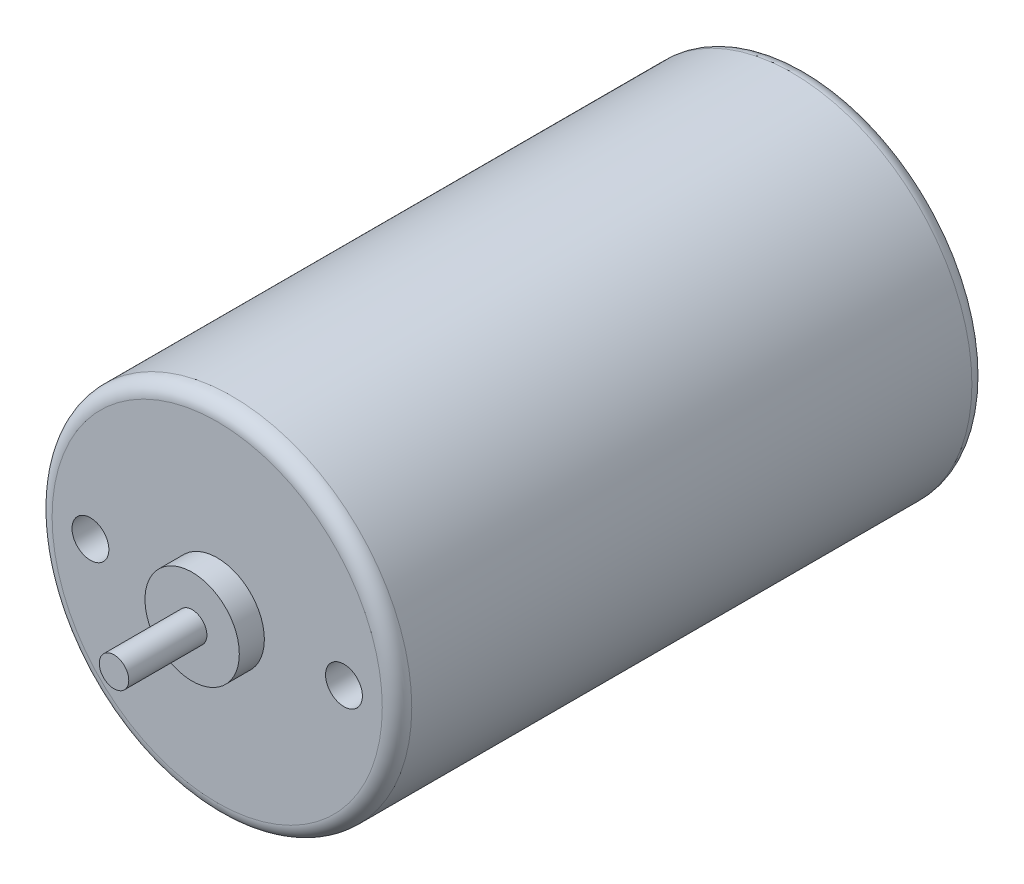
ISO-10303-21;
HEADER;
FILE_DESCRIPTION(('STEP AP214'),'2;1');
FILE_NAME('part.step','',(''),(''),'','','');
FILE_SCHEMA(('AUTOMOTIVE_DESIGN { 1 0 10303 214 1 1 1 1 }'));
ENDSEC;
DATA;
#1=APPLICATION_CONTEXT('core data for automotive mechanical design processes');
#2=APPLICATION_PROTOCOL_DEFINITION('international standard','automotive_design',2000,#1);
#3=PRODUCT_CONTEXT('',#1,'mechanical');
#4=PRODUCT('Part','Part','',(#3));
#5=PRODUCT_RELATED_PRODUCT_CATEGORY('part','',(#4));
#6=PRODUCT_DEFINITION_FORMATION('','',#4);
#7=PRODUCT_DEFINITION_CONTEXT('part definition',#1,'design');
#8=PRODUCT_DEFINITION('design','',#6,#7);
#9=PRODUCT_DEFINITION_SHAPE('','',#8);
#10=(LENGTH_UNIT() NAMED_UNIT(*) SI_UNIT(.MILLI.,.METRE.));
#11=(NAMED_UNIT(*) PLANE_ANGLE_UNIT() SI_UNIT($,.RADIAN.));
#12=(NAMED_UNIT(*) SI_UNIT($,.STERADIAN.) SOLID_ANGLE_UNIT());
#13=UNCERTAINTY_MEASURE_WITH_UNIT(LENGTH_MEASURE(1.E-05),#10,'distance_accuracy_value','');
#14=(GEOMETRIC_REPRESENTATION_CONTEXT(3) GLOBAL_UNCERTAINTY_ASSIGNED_CONTEXT((#13)) GLOBAL_UNIT_ASSIGNED_CONTEXT((#10,
#11,#12)) REPRESENTATION_CONTEXT('',''));
#15=CARTESIAN_POINT('',(0.,0.,0.));
#16=DIRECTION('',(0.,0.,1.));
#17=DIRECTION('',(1.,0.,0.));
#18=AXIS2_PLACEMENT_3D('',#15,#16,#17);
#19=CARTESIAN_POINT('',(0.,0.,40.));
#20=DIRECTION('',(0.,0.,-1.));
#21=DIRECTION('',(-1.,0.,0.));
#22=AXIS2_PLACEMENT_3D('',#19,#20,#21);
#23=CYLINDRICAL_SURFACE('',#22,12.2);
#24=CARTESIAN_POINT('',(0.,0.,1.));
#25=DIRECTION('',(0.,0.,1.));
#26=DIRECTION('',(1.,0.,0.));
#27=AXIS2_PLACEMENT_3D('',#24,#25,#26);
#28=CIRCLE('',#27,12.2);
#29=CARTESIAN_POINT('',(12.2,0.,1.));
#30=VERTEX_POINT('',#29);
#31=EDGE_CURVE('E50',#30,#30,#28,.T.);
#32=ORIENTED_EDGE('',*,*,#31,.T.);
#33=EDGE_LOOP('',(#32));
#34=FACE_BOUND('',#33,.T.);
#35=CARTESIAN_POINT('',(0.,0.,39.));
#36=DIRECTION('',(0.,0.,1.));
#37=DIRECTION('',(1.,0.,0.));
#38=AXIS2_PLACEMENT_3D('',#35,#36,#37);
#39=CIRCLE('',#38,12.2);
#40=CARTESIAN_POINT('',(12.2,0.,39.));
#41=VERTEX_POINT('',#40);
#42=EDGE_CURVE('E101',#41,#41,#39,.F.);
#43=ORIENTED_EDGE('',*,*,#42,.T.);
#44=EDGE_LOOP('',(#43));
#45=FACE_BOUND('',#44,.T.);
#46=ADVANCED_FACE('F41',(#34,#45),#23,.T.);
#47=CARTESIAN_POINT('',(0.,0.,40.));
#48=DIRECTION('',(0.,0.,1.));
#49=DIRECTION('',(1.,0.,0.));
#50=AXIS2_PLACEMENT_3D('',#47,#48,#49);
#51=PLANE('',#50);
#52=CARTESIAN_POINT('',(0.,0.,40.));
#53=DIRECTION('',(0.,0.,1.));
#54=DIRECTION('',(1.,0.,0.));
#55=AXIS2_PLACEMENT_3D('',#52,#53,#54);
#56=CIRCLE('',#55,11.2);
#57=CARTESIAN_POINT('',(11.2,0.,40.));
#58=VERTEX_POINT('',#57);
#59=EDGE_CURVE('E90',#58,#58,#56,.T.);
#60=ORIENTED_EDGE('',*,*,#59,.T.);
#61=EDGE_LOOP('',(#60));
#62=FACE_BOUND('',#61,.T.);
#63=CARTESIAN_POINT('',(-8.6,0.,40.));
#64=DIRECTION('',(0.,0.,1.));
#65=DIRECTION('',(1.,0.,0.));
#66=AXIS2_PLACEMENT_3D('',#63,#64,#65);
#67=CIRCLE('',#66,1.24999999999999);
#68=CARTESIAN_POINT('',(-7.35000000000001,0.,40.));
#69=VERTEX_POINT('',#68);
#70=EDGE_CURVE('E68',#69,#69,#67,.T.);
#71=ORIENTED_EDGE('',*,*,#70,.F.);
#72=EDGE_LOOP('',(#71));
#73=FACE_BOUND('',#72,.T.);
#74=CARTESIAN_POINT('',(8.6,0.,40.));
#75=DIRECTION('',(0.,0.,1.));
#76=DIRECTION('',(1.,0.,0.));
#77=AXIS2_PLACEMENT_3D('',#74,#75,#76);
#78=CIRCLE('',#77,1.24999999999999);
#79=CARTESIAN_POINT('',(9.84999999999999,0.,40.));
#80=VERTEX_POINT('',#79);
#81=EDGE_CURVE('E67',#80,#80,#78,.T.);
#82=ORIENTED_EDGE('',*,*,#81,.F.);
#83=EDGE_LOOP('',(#82));
#84=FACE_BOUND('',#83,.T.);
#85=CARTESIAN_POINT('',(0.,0.,40.));
#86=DIRECTION('',(0.,0.,1.));
#87=DIRECTION('',(1.,0.,0.));
#88=AXIS2_PLACEMENT_3D('',#85,#86,#87);
#89=CIRCLE('',#88,3.2);
#90=CARTESIAN_POINT('',(3.2,0.,40.));
#91=VERTEX_POINT('',#90);
#92=EDGE_CURVE('E91',#91,#91,#89,.T.);
#93=ORIENTED_EDGE('',*,*,#92,.F.);
#94=EDGE_LOOP('',(#93));
#95=FACE_BOUND('',#94,.T.);
#96=ADVANCED_FACE('F119',(#62,#73,#84,#95),#51,.T.);
#97=CARTESIAN_POINT('',(0.,0.,0.));
#98=DIRECTION('',(0.,0.,1.));
#99=DIRECTION('',(1.,0.,0.));
#100=AXIS2_PLACEMENT_3D('',#97,#98,#99);
#101=PLANE('',#100);
#102=CARTESIAN_POINT('',(0.,0.,0.));
#103=DIRECTION('',(0.,0.,1.));
#104=DIRECTION('',(1.,0.,0.));
#105=AXIS2_PLACEMENT_3D('',#102,#103,#104);
#106=CIRCLE('',#105,11.2);
#107=CARTESIAN_POINT('',(11.2,0.,0.));
#108=VERTEX_POINT('',#107);
#109=EDGE_CURVE('E11',#108,#108,#106,.F.);
#110=ORIENTED_EDGE('',*,*,#109,.T.);
#111=EDGE_LOOP('',(#110));
#112=FACE_BOUND('',#111,.T.);
#113=ADVANCED_FACE('F124',(#112),#101,.F.);
#114=CARTESIAN_POINT('',(0.,0.,41.7));
#115=DIRECTION('',(0.,0.,-1.));
#116=DIRECTION('',(-1.,0.,0.));
#117=AXIS2_PLACEMENT_3D('',#114,#115,#116);
#118=CYLINDRICAL_SURFACE('',#117,3.2);
#119=CARTESIAN_POINT('',(0.,0.,41.7));
#120=DIRECTION('',(0.,0.,1.));
#121=DIRECTION('',(1.,0.,0.));
#122=AXIS2_PLACEMENT_3D('',#119,#120,#121);
#123=CIRCLE('',#122,3.2);
#124=CARTESIAN_POINT('',(3.2,0.,41.7));
#125=VERTEX_POINT('',#124);
#126=EDGE_CURVE('E85',#125,#125,#123,.T.);
#127=ORIENTED_EDGE('',*,*,#126,.F.);
#128=EDGE_LOOP('',(#127));
#129=FACE_BOUND('',#128,.T.);
#130=ORIENTED_EDGE('',*,*,#92,.T.);
#131=EDGE_LOOP('',(#130));
#132=FACE_BOUND('',#131,.T.);
#133=ADVANCED_FACE('F129',(#129,#132),#118,.T.);
#134=CARTESIAN_POINT('',(0.,0.,41.7));
#135=DIRECTION('',(0.,0.,1.));
#136=DIRECTION('',(1.,0.,0.));
#137=AXIS2_PLACEMENT_3D('',#134,#135,#136);
#138=PLANE('',#137);
#139=CARTESIAN_POINT('',(0.,0.,41.7));
#140=DIRECTION('',(0.,0.,1.));
#141=DIRECTION('',(1.,0.,0.));
#142=AXIS2_PLACEMENT_3D('',#139,#140,#141);
#143=CIRCLE('',#142,1.);
#144=CARTESIAN_POINT('',(1.,0.,41.7));
#145=VERTEX_POINT('',#144);
#146=EDGE_CURVE('E86',#145,#145,#143,.T.);
#147=ORIENTED_EDGE('',*,*,#146,.F.);
#148=EDGE_LOOP('',(#147));
#149=FACE_BOUND('',#148,.T.);
#150=ORIENTED_EDGE('',*,*,#126,.T.);
#151=EDGE_LOOP('',(#150));
#152=FACE_BOUND('',#151,.T.);
#153=ADVANCED_FACE('F134',(#149,#152),#138,.T.);
#154=CARTESIAN_POINT('',(0.,0.,47.));
#155=DIRECTION('',(0.,0.,-1.));
#156=DIRECTION('',(-1.,0.,0.));
#157=AXIS2_PLACEMENT_3D('',#154,#155,#156);
#158=CYLINDRICAL_SURFACE('',#157,1.);
#159=CARTESIAN_POINT('',(0.,0.,47.));
#160=DIRECTION('',(0.,0.,1.));
#161=DIRECTION('',(1.,0.,0.));
#162=AXIS2_PLACEMENT_3D('',#159,#160,#161);
#163=CIRCLE('',#162,1.);
#164=CARTESIAN_POINT('',(1.,0.,47.));
#165=VERTEX_POINT('',#164);
#166=EDGE_CURVE('E81',#165,#165,#163,.T.);
#167=ORIENTED_EDGE('',*,*,#166,.F.);
#168=EDGE_LOOP('',(#167));
#169=FACE_BOUND('',#168,.T.);
#170=ORIENTED_EDGE('',*,*,#146,.T.);
#171=EDGE_LOOP('',(#170));
#172=FACE_BOUND('',#171,.T.);
#173=ADVANCED_FACE('F138',(#169,#172),#158,.T.);
#174=CARTESIAN_POINT('',(0.,0.,47.));
#175=DIRECTION('',(0.,0.,1.));
#176=DIRECTION('',(1.,0.,0.));
#177=AXIS2_PLACEMENT_3D('',#174,#175,#176);
#178=PLANE('',#177);
#179=ORIENTED_EDGE('',*,*,#166,.T.);
#180=EDGE_LOOP('',(#179));
#181=FACE_BOUND('',#180,.T.);
#182=ADVANCED_FACE('F142',(#181),#178,.T.);
#183=CARTESIAN_POINT('',(8.6,0.,36.));
#184=DIRECTION('',(0.,0.,1.));
#185=DIRECTION('',(1.,0.,0.));
#186=AXIS2_PLACEMENT_3D('',#183,#184,#185);
#187=CONICAL_SURFACE('',#186,1.25,1.02974425867665);
#188=CARTESIAN_POINT('',(8.6,0.,35.2489242262155));
#189=VERTEX_POINT('',#188);
#190=VERTEX_LOOP('',#189);
#191=FACE_BOUND('',#190,.T.);
#192=CARTESIAN_POINT('',(8.6,0.,36.));
#193=DIRECTION('',(0.,0.,1.));
#194=DIRECTION('',(1.,0.,0.));
#195=AXIS2_PLACEMENT_3D('',#192,#193,#194);
#196=CIRCLE('',#195,1.25);
#197=CARTESIAN_POINT('',(9.85,0.,36.));
#198=VERTEX_POINT('',#197);
#199=EDGE_CURVE('E73',#198,#198,#196,.T.);
#200=ORIENTED_EDGE('',*,*,#199,.T.);
#201=EDGE_LOOP('',(#200));
#202=FACE_BOUND('',#201,.T.);
#203=ADVANCED_FACE('F146',(#191,#202),#187,.F.);
#204=CARTESIAN_POINT('',(8.6,0.,40.));
#205=DIRECTION('',(0.,0.,1.));
#206=DIRECTION('',(1.,0.,0.));
#207=AXIS2_PLACEMENT_3D('',#204,#205,#206);
#208=CYLINDRICAL_SURFACE('',#207,1.24999999999999);
#209=ORIENTED_EDGE('',*,*,#199,.F.);
#210=EDGE_LOOP('',(#209));
#211=FACE_BOUND('',#210,.T.);
#212=ORIENTED_EDGE('',*,*,#81,.T.);
#213=EDGE_LOOP('',(#212));
#214=FACE_BOUND('',#213,.T.);
#215=ADVANCED_FACE('F60',(#211,#214),#208,.F.);
#216=CARTESIAN_POINT('',(-8.6,0.,36.));
#217=DIRECTION('',(0.,0.,1.));
#218=DIRECTION('',(1.,0.,0.));
#219=AXIS2_PLACEMENT_3D('',#216,#217,#218);
#220=CONICAL_SURFACE('',#219,1.25,1.02974425867665);
#221=CARTESIAN_POINT('',(-8.6,0.,35.2489242262155));
#222=VERTEX_POINT('',#221);
#223=VERTEX_LOOP('',#222);
#224=FACE_BOUND('',#223,.T.);
#225=CARTESIAN_POINT('',(-8.6,0.,36.));
#226=DIRECTION('',(0.,0.,1.));
#227=DIRECTION('',(1.,0.,0.));
#228=AXIS2_PLACEMENT_3D('',#225,#226,#227);
#229=CIRCLE('',#228,1.25);
#230=CARTESIAN_POINT('',(-7.35,0.,36.));
#231=VERTEX_POINT('',#230);
#232=EDGE_CURVE('E64',#231,#231,#229,.T.);
#233=ORIENTED_EDGE('',*,*,#232,.T.);
#234=EDGE_LOOP('',(#233));
#235=FACE_BOUND('',#234,.T.);
#236=ADVANCED_FACE('F56',(#224,#235),#220,.F.);
#237=CARTESIAN_POINT('',(-8.6,0.,40.));
#238=DIRECTION('',(0.,0.,1.));
#239=DIRECTION('',(1.,0.,0.));
#240=AXIS2_PLACEMENT_3D('',#237,#238,#239);
#241=CYLINDRICAL_SURFACE('',#240,1.24999999999999);
#242=ORIENTED_EDGE('',*,*,#232,.F.);
#243=EDGE_LOOP('',(#242));
#244=FACE_BOUND('',#243,.T.);
#245=ORIENTED_EDGE('',*,*,#70,.T.);
#246=EDGE_LOOP('',(#245));
#247=FACE_BOUND('',#246,.T.);
#248=ADVANCED_FACE('F59',(#244,#247),#241,.F.);
#249=CARTESIAN_POINT('',(0.,0.,39.));
#250=DIRECTION('',(0.,0.,1.));
#251=DIRECTION('',(1.,0.,0.));
#252=AXIS2_PLACEMENT_3D('',#249,#250,#251);
#253=TOROIDAL_SURFACE('',#252,11.2,1.);
#254=ORIENTED_EDGE('',*,*,#42,.F.);
#255=EDGE_LOOP('',(#254));
#256=FACE_BOUND('',#255,.T.);
#257=ORIENTED_EDGE('',*,*,#59,.F.);
#258=EDGE_LOOP('',(#257));
#259=FACE_BOUND('',#258,.T.);
#260=ADVANCED_FACE('F111',(#256,#259),#253,.T.);
#261=CARTESIAN_POINT('',(0.,0.,1.));
#262=DIRECTION('',(0.,0.,1.));
#263=DIRECTION('',(1.,0.,0.));
#264=AXIS2_PLACEMENT_3D('',#261,#262,#263);
#265=TOROIDAL_SURFACE('',#264,11.2,1.);
#266=ORIENTED_EDGE('',*,*,#109,.F.);
#267=EDGE_LOOP('',(#266));
#268=FACE_BOUND('',#267,.T.);
#269=ORIENTED_EDGE('',*,*,#31,.F.);
#270=EDGE_LOOP('',(#269));
#271=FACE_BOUND('',#270,.T.);
#272=ADVANCED_FACE('F43',(#268,#271),#265,.T.);
#273=CLOSED_SHELL('',(#46,#96,#113,#133,#153,#173,#182,#203,#215,#236,#248,#260,#272));
#274=MANIFOLD_SOLID_BREP('B2',#273);
#275=ADVANCED_BREP_SHAPE_REPRESENTATION('',(#18,#274),#14);
#276=SHAPE_DEFINITION_REPRESENTATION(#9,#275);
ENDSEC;
END-ISO-10303-21;
